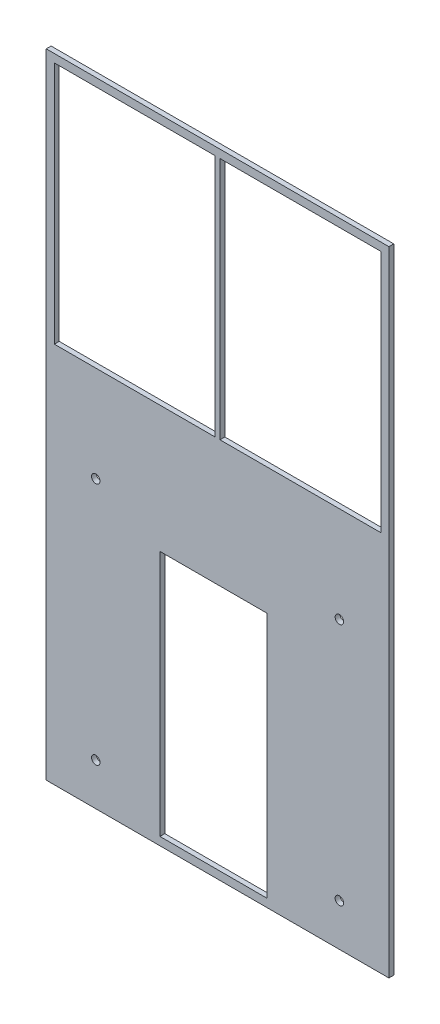
ISO-10303-21;
HEADER;
FILE_DESCRIPTION(('STEP AP214'),'2;1');
FILE_NAME('part.step','',(''),(''),'','','');
FILE_SCHEMA(('AUTOMOTIVE_DESIGN { 1 0 10303 214 1 1 1 1 }'));
ENDSEC;
DATA;
#1=APPLICATION_CONTEXT('core data for automotive mechanical design processes');
#2=APPLICATION_PROTOCOL_DEFINITION('international standard','automotive_design',2000,#1);
#3=PRODUCT_CONTEXT('',#1,'mechanical');
#4=PRODUCT('Part','Part','',(#3));
#5=PRODUCT_RELATED_PRODUCT_CATEGORY('part','',(#4));
#6=PRODUCT_DEFINITION_FORMATION('','',#4);
#7=PRODUCT_DEFINITION_CONTEXT('part definition',#1,'design');
#8=PRODUCT_DEFINITION('design','',#6,#7);
#9=PRODUCT_DEFINITION_SHAPE('','',#8);
#10=(LENGTH_UNIT() NAMED_UNIT(*) SI_UNIT(.MILLI.,.METRE.));
#11=(NAMED_UNIT(*) PLANE_ANGLE_UNIT() SI_UNIT($,.RADIAN.));
#12=(NAMED_UNIT(*) SI_UNIT($,.STERADIAN.) SOLID_ANGLE_UNIT());
#13=UNCERTAINTY_MEASURE_WITH_UNIT(LENGTH_MEASURE(1.E-05),#10,'distance_accuracy_value','');
#14=(GEOMETRIC_REPRESENTATION_CONTEXT(3) GLOBAL_UNCERTAINTY_ASSIGNED_CONTEXT((#13)) GLOBAL_UNIT_ASSIGNED_CONTEXT((#10,
#11,#12)) REPRESENTATION_CONTEXT('',''));
#15=CARTESIAN_POINT('',(0.,0.,0.));
#16=DIRECTION('',(0.,0.,1.));
#17=DIRECTION('',(1.,0.,0.));
#18=AXIS2_PLACEMENT_3D('',#15,#16,#17);
#19=CARTESIAN_POINT('',(0.,0.,3.));
#20=DIRECTION('',(0.,0.,1.));
#21=DIRECTION('',(1.,0.,0.));
#22=AXIS2_PLACEMENT_3D('',#19,#20,#21);
#23=PLANE('',#22);
#24=CARTESIAN_POINT('',(-24.,-284.,3.));
#25=DIRECTION('',(0.,0.,1.));
#26=DIRECTION('',(1.,0.,0.));
#27=AXIS2_PLACEMENT_3D('',#24,#25,#26);
#28=CIRCLE('',#27,2.59999999999999);
#29=CARTESIAN_POINT('',(-21.4,-284.,3.));
#30=VERTEX_POINT('',#29);
#31=EDGE_CURVE('E487',#30,#30,#28,.T.);
#32=ORIENTED_EDGE('',*,*,#31,.F.);
#33=EDGE_LOOP('',(#32));
#34=FACE_BOUND('',#33,.T.);
#35=CARTESIAN_POINT('',(126.,-284.,3.));
#36=DIRECTION('',(0.,0.,1.));
#37=DIRECTION('',(1.,0.,0.));
#38=AXIS2_PLACEMENT_3D('',#35,#36,#37);
#39=CIRCLE('',#38,2.59999999999999);
#40=CARTESIAN_POINT('',(128.6,-284.,3.));
#41=VERTEX_POINT('',#40);
#42=EDGE_CURVE('E489',#41,#41,#39,.T.);
#43=ORIENTED_EDGE('',*,*,#42,.F.);
#44=EDGE_LOOP('',(#43));
#45=FACE_BOUND('',#44,.T.);
#46=CARTESIAN_POINT('',(126.,-134.,3.));
#47=DIRECTION('',(0.,0.,1.));
#48=DIRECTION('',(1.,0.,0.));
#49=AXIS2_PLACEMENT_3D('',#46,#47,#48);
#50=CIRCLE('',#49,2.59999999999996);
#51=CARTESIAN_POINT('',(128.6,-134.,3.));
#52=VERTEX_POINT('',#51);
#53=EDGE_CURVE('E500',#52,#52,#50,.T.);
#54=ORIENTED_EDGE('',*,*,#53,.F.);
#55=EDGE_LOOP('',(#54));
#56=FACE_BOUND('',#55,.T.);
#57=CARTESIAN_POINT('',(-24.,-134.,3.));
#58=DIRECTION('',(0.,0.,1.));
#59=DIRECTION('',(1.,0.,0.));
#60=AXIS2_PLACEMENT_3D('',#57,#58,#59);
#61=CIRCLE('',#60,2.59999999999999);
#62=CARTESIAN_POINT('',(-21.4,-134.,3.));
#63=VERTEX_POINT('',#62);
#64=EDGE_CURVE('E494',#63,#63,#61,.T.);
#65=ORIENTED_EDGE('',*,*,#64,.F.);
#66=EDGE_LOOP('',(#65));
#67=FACE_BOUND('',#66,.T.);
#68=DIRECTION('',(0.,-1.,0.));
#69=VECTOR('',#68,1.);
#70=CARTESIAN_POINT('',(-54.5,80.,3.));
#71=LINE('',#70,#69);
#72=CARTESIAN_POINT('',(-54.5,80.,3.));
#73=VERTEX_POINT('',#72);
#74=CARTESIAN_POINT('',(-54.5,-310.,3.));
#75=VERTEX_POINT('',#74);
#76=EDGE_CURVE('E246',#73,#75,#71,.T.);
#77=ORIENTED_EDGE('',*,*,#76,.T.);
#78=DIRECTION('',(1.,0.,0.));
#79=VECTOR('',#78,1.);
#80=CARTESIAN_POINT('',(-54.5,-310.,3.));
#81=LINE('',#80,#79);
#82=CARTESIAN_POINT('',(156.5,-310.,3.));
#83=VERTEX_POINT('',#82);
#84=EDGE_CURVE('E249',#75,#83,#81,.T.);
#85=ORIENTED_EDGE('',*,*,#84,.T.);
#86=DIRECTION('',(0.,1.,0.));
#87=VECTOR('',#86,1.);
#88=CARTESIAN_POINT('',(156.5,80.,3.));
#89=LINE('',#88,#87);
#90=CARTESIAN_POINT('',(156.5,80.,3.));
#91=VERTEX_POINT('',#90);
#92=EDGE_CURVE('E252',#83,#91,#89,.T.);
#93=ORIENTED_EDGE('',*,*,#92,.T.);
#94=DIRECTION('',(-1.,0.,0.));
#95=VECTOR('',#94,1.);
#96=CARTESIAN_POINT('',(-54.5,80.,3.));
#97=LINE('',#96,#95);
#98=EDGE_CURVE('E254',#91,#73,#97,.T.);
#99=ORIENTED_EDGE('',*,*,#98,.T.);
#100=EDGE_LOOP('',(#77,#85,#93,#99));
#101=FACE_BOUND('',#100,.T.);
#102=DIRECTION('',(1.,0.,0.));
#103=VECTOR('',#102,1.);
#104=CARTESIAN_POINT('',(-49.5,-75.,3.));
#105=LINE('',#104,#103);
#106=CARTESIAN_POINT('',(-49.5,-75.,3.));
#107=VERTEX_POINT('',#106);
#108=CARTESIAN_POINT('',(49.5,-75.,3.));
#109=VERTEX_POINT('',#108);
#110=EDGE_CURVE('E217',#107,#109,#105,.T.);
#111=ORIENTED_EDGE('',*,*,#110,.F.);
#112=DIRECTION('',(0.,-1.,0.));
#113=VECTOR('',#112,1.);
#114=CARTESIAN_POINT('',(-49.5,75.,3.));
#115=LINE('',#114,#113);
#116=CARTESIAN_POINT('',(-49.5,75.,3.));
#117=VERTEX_POINT('',#116);
#118=EDGE_CURVE('E215',#117,#107,#115,.T.);
#119=ORIENTED_EDGE('',*,*,#118,.F.);
#120=DIRECTION('',(-1.,0.,0.));
#121=VECTOR('',#120,1.);
#122=CARTESIAN_POINT('',(-49.5,75.,3.));
#123=LINE('',#122,#121);
#124=CARTESIAN_POINT('',(49.5,75.,3.));
#125=VERTEX_POINT('',#124);
#126=EDGE_CURVE('E223',#125,#117,#123,.T.);
#127=ORIENTED_EDGE('',*,*,#126,.F.);
#128=DIRECTION('',(0.,1.,0.));
#129=VECTOR('',#128,1.);
#130=CARTESIAN_POINT('',(49.5,75.,3.));
#131=LINE('',#130,#129);
#132=EDGE_CURVE('E220',#109,#125,#131,.T.);
#133=ORIENTED_EDGE('',*,*,#132,.F.);
#134=EDGE_LOOP('',(#111,#119,#127,#133));
#135=FACE_BOUND('',#134,.T.);
#136=DIRECTION('',(1.,0.,0.));
#137=VECTOR('',#136,1.);
#138=CARTESIAN_POINT('',(52.5,-75.,3.));
#139=LINE('',#138,#137);
#140=CARTESIAN_POINT('',(52.5,-75.,3.));
#141=VERTEX_POINT('',#140);
#142=CARTESIAN_POINT('',(151.5,-75.,3.));
#143=VERTEX_POINT('',#142);
#144=EDGE_CURVE('E186',#141,#143,#139,.T.);
#145=ORIENTED_EDGE('',*,*,#144,.F.);
#146=DIRECTION('',(0.,-1.,0.));
#147=VECTOR('',#146,1.);
#148=CARTESIAN_POINT('',(52.5,75.,3.));
#149=LINE('',#148,#147);
#150=CARTESIAN_POINT('',(52.5,75.,3.));
#151=VERTEX_POINT('',#150);
#152=EDGE_CURVE('E184',#151,#141,#149,.T.);
#153=ORIENTED_EDGE('',*,*,#152,.F.);
#154=DIRECTION('',(-1.,0.,0.));
#155=VECTOR('',#154,1.);
#156=CARTESIAN_POINT('',(52.5,75.,3.));
#157=LINE('',#156,#155);
#158=CARTESIAN_POINT('',(151.5,75.,3.));
#159=VERTEX_POINT('',#158);
#160=EDGE_CURVE('E192',#159,#151,#157,.T.);
#161=ORIENTED_EDGE('',*,*,#160,.F.);
#162=DIRECTION('',(0.,1.,0.));
#163=VECTOR('',#162,1.);
#164=CARTESIAN_POINT('',(151.5,75.,3.));
#165=LINE('',#164,#163);
#166=EDGE_CURVE('E189',#143,#159,#165,.T.);
#167=ORIENTED_EDGE('',*,*,#166,.F.);
#168=EDGE_LOOP('',(#145,#153,#161,#167));
#169=FACE_BOUND('',#168,.T.);
#170=DIRECTION('',(1.,0.,0.));
#171=VECTOR('',#170,1.);
#172=CARTESIAN_POINT('',(15.5,-305.,3.));
#173=LINE('',#172,#171);
#174=CARTESIAN_POINT('',(15.5,-305.,3.));
#175=VERTEX_POINT('',#174);
#176=CARTESIAN_POINT('',(81.5,-305.,3.));
#177=VERTEX_POINT('',#176);
#178=EDGE_CURVE('E154',#175,#177,#173,.T.);
#179=ORIENTED_EDGE('',*,*,#178,.F.);
#180=DIRECTION('',(0.,-1.,0.));
#181=VECTOR('',#180,1.);
#182=CARTESIAN_POINT('',(15.5,-153.,3.));
#183=LINE('',#182,#181);
#184=CARTESIAN_POINT('',(15.5,-153.,3.));
#185=VERTEX_POINT('',#184);
#186=EDGE_CURVE('E146',#185,#175,#183,.T.);
#187=ORIENTED_EDGE('',*,*,#186,.F.);
#188=DIRECTION('',(-1.,0.,0.));
#189=VECTOR('',#188,1.);
#190=CARTESIAN_POINT('',(15.5,-153.,3.));
#191=LINE('',#190,#189);
#192=CARTESIAN_POINT('',(81.5,-153.,3.));
#193=VERTEX_POINT('',#192);
#194=EDGE_CURVE('E168',#193,#185,#191,.T.);
#195=ORIENTED_EDGE('',*,*,#194,.F.);
#196=DIRECTION('',(0.,1.,0.));
#197=VECTOR('',#196,1.);
#198=CARTESIAN_POINT('',(81.5,-153.,3.));
#199=LINE('',#198,#197);
#200=EDGE_CURVE('E166',#177,#193,#199,.T.);
#201=ORIENTED_EDGE('',*,*,#200,.F.);
#202=EDGE_LOOP('',(#179,#187,#195,#201));
#203=FACE_BOUND('',#202,.T.);
#204=ADVANCED_FACE('F33',(#34,#45,#56,#67,#101,#135,#169,#203),#23,.T.);
#205=CARTESIAN_POINT('',(0.,0.,0.));
#206=DIRECTION('',(0.,0.,1.));
#207=DIRECTION('',(1.,0.,0.));
#208=AXIS2_PLACEMENT_3D('',#205,#206,#207);
#209=PLANE('',#208);
#210=CARTESIAN_POINT('',(-24.,-284.,0.));
#211=DIRECTION('',(0.,0.,1.));
#212=DIRECTION('',(1.,0.,0.));
#213=AXIS2_PLACEMENT_3D('',#210,#211,#212);
#214=CIRCLE('',#213,2.59999999999999);
#215=CARTESIAN_POINT('',(-21.4,-284.,0.));
#216=VERTEX_POINT('',#215);
#217=EDGE_CURVE('E485',#216,#216,#214,.T.);
#218=ORIENTED_EDGE('',*,*,#217,.T.);
#219=EDGE_LOOP('',(#218));
#220=FACE_BOUND('',#219,.T.);
#221=CARTESIAN_POINT('',(126.,-284.,0.));
#222=DIRECTION('',(0.,0.,1.));
#223=DIRECTION('',(1.,0.,0.));
#224=AXIS2_PLACEMENT_3D('',#221,#222,#223);
#225=CIRCLE('',#224,2.59999999999999);
#226=CARTESIAN_POINT('',(128.6,-284.,0.));
#227=VERTEX_POINT('',#226);
#228=EDGE_CURVE('E505',#227,#227,#225,.T.);
#229=ORIENTED_EDGE('',*,*,#228,.T.);
#230=EDGE_LOOP('',(#229));
#231=FACE_BOUND('',#230,.T.);
#232=CARTESIAN_POINT('',(126.,-134.,0.));
#233=DIRECTION('',(0.,0.,1.));
#234=DIRECTION('',(1.,0.,0.));
#235=AXIS2_PLACEMENT_3D('',#232,#233,#234);
#236=CIRCLE('',#235,2.59999999999996);
#237=CARTESIAN_POINT('',(128.6,-134.,0.));
#238=VERTEX_POINT('',#237);
#239=EDGE_CURVE('E496',#238,#238,#236,.T.);
#240=ORIENTED_EDGE('',*,*,#239,.T.);
#241=EDGE_LOOP('',(#240));
#242=FACE_BOUND('',#241,.T.);
#243=CARTESIAN_POINT('',(-24.,-134.,0.));
#244=DIRECTION('',(0.,0.,1.));
#245=DIRECTION('',(1.,0.,0.));
#246=AXIS2_PLACEMENT_3D('',#243,#244,#245);
#247=CIRCLE('',#246,2.59999999999999);
#248=CARTESIAN_POINT('',(-21.4,-134.,0.));
#249=VERTEX_POINT('',#248);
#250=EDGE_CURVE('E174',#249,#249,#247,.T.);
#251=ORIENTED_EDGE('',*,*,#250,.T.);
#252=EDGE_LOOP('',(#251));
#253=FACE_BOUND('',#252,.T.);
#254=DIRECTION('',(0.,-1.,0.));
#255=VECTOR('',#254,1.);
#256=CARTESIAN_POINT('',(52.5,75.,0.));
#257=LINE('',#256,#255);
#258=CARTESIAN_POINT('',(52.5,75.,0.));
#259=VERTEX_POINT('',#258);
#260=CARTESIAN_POINT('',(52.5,-75.,0.));
#261=VERTEX_POINT('',#260);
#262=EDGE_CURVE('E162',#259,#261,#257,.T.);
#263=ORIENTED_EDGE('',*,*,#262,.T.);
#264=DIRECTION('',(1.,0.,0.));
#265=VECTOR('',#264,1.);
#266=CARTESIAN_POINT('',(52.5,-75.,0.));
#267=LINE('',#266,#265);
#268=CARTESIAN_POINT('',(151.5,-75.,0.));
#269=VERTEX_POINT('',#268);
#270=EDGE_CURVE('E197',#261,#269,#267,.T.);
#271=ORIENTED_EDGE('',*,*,#270,.T.);
#272=DIRECTION('',(0.,1.,0.));
#273=VECTOR('',#272,1.);
#274=CARTESIAN_POINT('',(151.5,75.,0.));
#275=LINE('',#274,#273);
#276=CARTESIAN_POINT('',(151.5,75.,0.));
#277=VERTEX_POINT('',#276);
#278=EDGE_CURVE('E200',#269,#277,#275,.T.);
#279=ORIENTED_EDGE('',*,*,#278,.T.);
#280=DIRECTION('',(-1.,0.,0.));
#281=VECTOR('',#280,1.);
#282=CARTESIAN_POINT('',(52.5,75.,0.));
#283=LINE('',#282,#281);
#284=EDGE_CURVE('E187',#277,#259,#283,.T.);
#285=ORIENTED_EDGE('',*,*,#284,.T.);
#286=EDGE_LOOP('',(#263,#271,#279,#285));
#287=FACE_BOUND('',#286,.T.);
#288=DIRECTION('',(0.,-1.,0.));
#289=VECTOR('',#288,1.);
#290=CARTESIAN_POINT('',(-54.5,80.,0.));
#291=LINE('',#290,#289);
#292=CARTESIAN_POINT('',(-54.5,80.,0.));
#293=VERTEX_POINT('',#292);
#294=CARTESIAN_POINT('',(-54.5,-310.,0.));
#295=VERTEX_POINT('',#294);
#296=EDGE_CURVE('E245',#293,#295,#291,.T.);
#297=ORIENTED_EDGE('',*,*,#296,.F.);
#298=DIRECTION('',(-1.,0.,0.));
#299=VECTOR('',#298,1.);
#300=CARTESIAN_POINT('',(-54.5,80.,0.));
#301=LINE('',#300,#299);
#302=CARTESIAN_POINT('',(156.5,80.,0.));
#303=VERTEX_POINT('',#302);
#304=EDGE_CURVE('E250',#303,#293,#301,.T.);
#305=ORIENTED_EDGE('',*,*,#304,.F.);
#306=DIRECTION('',(0.,1.,0.));
#307=VECTOR('',#306,1.);
#308=CARTESIAN_POINT('',(156.5,80.,0.));
#309=LINE('',#308,#307);
#310=CARTESIAN_POINT('',(156.5,-310.,0.));
#311=VERTEX_POINT('',#310);
#312=EDGE_CURVE('E261',#311,#303,#309,.T.);
#313=ORIENTED_EDGE('',*,*,#312,.F.);
#314=DIRECTION('',(1.,0.,0.));
#315=VECTOR('',#314,1.);
#316=CARTESIAN_POINT('',(-54.5,-310.,0.));
#317=LINE('',#316,#315);
#318=EDGE_CURVE('E259',#295,#311,#317,.T.);
#319=ORIENTED_EDGE('',*,*,#318,.F.);
#320=EDGE_LOOP('',(#297,#305,#313,#319));
#321=FACE_BOUND('',#320,.T.);
#322=DIRECTION('',(0.,-1.,0.));
#323=VECTOR('',#322,1.);
#324=CARTESIAN_POINT('',(-49.5,75.,0.));
#325=LINE('',#324,#323);
#326=CARTESIAN_POINT('',(-49.5,75.,0.));
#327=VERTEX_POINT('',#326);
#328=CARTESIAN_POINT('',(-49.5,-75.,0.));
#329=VERTEX_POINT('',#328);
#330=EDGE_CURVE('E214',#327,#329,#325,.T.);
#331=ORIENTED_EDGE('',*,*,#330,.T.);
#332=DIRECTION('',(1.,0.,0.));
#333=VECTOR('',#332,1.);
#334=CARTESIAN_POINT('',(-49.5,-75.,0.));
#335=LINE('',#334,#333);
#336=CARTESIAN_POINT('',(49.5,-75.,0.));
#337=VERTEX_POINT('',#336);
#338=EDGE_CURVE('E228',#329,#337,#335,.T.);
#339=ORIENTED_EDGE('',*,*,#338,.T.);
#340=DIRECTION('',(0.,1.,0.));
#341=VECTOR('',#340,1.);
#342=CARTESIAN_POINT('',(49.5,75.,0.));
#343=LINE('',#342,#341);
#344=CARTESIAN_POINT('',(49.5,75.,0.));
#345=VERTEX_POINT('',#344);
#346=EDGE_CURVE('E231',#337,#345,#343,.T.);
#347=ORIENTED_EDGE('',*,*,#346,.T.);
#348=DIRECTION('',(-1.,0.,0.));
#349=VECTOR('',#348,1.);
#350=CARTESIAN_POINT('',(-49.5,75.,0.));
#351=LINE('',#350,#349);
#352=EDGE_CURVE('E218',#345,#327,#351,.T.);
#353=ORIENTED_EDGE('',*,*,#352,.T.);
#354=EDGE_LOOP('',(#331,#339,#347,#353));
#355=FACE_BOUND('',#354,.T.);
#356=DIRECTION('',(0.,-1.,0.));
#357=VECTOR('',#356,1.);
#358=CARTESIAN_POINT('',(15.5,-153.,0.));
#359=LINE('',#358,#357);
#360=CARTESIAN_POINT('',(15.5,-153.,0.));
#361=VERTEX_POINT('',#360);
#362=CARTESIAN_POINT('',(15.5,-305.,0.));
#363=VERTEX_POINT('',#362);
#364=EDGE_CURVE('E56',#361,#363,#359,.T.);
#365=ORIENTED_EDGE('',*,*,#364,.T.);
#366=DIRECTION('',(1.,0.,0.));
#367=VECTOR('',#366,1.);
#368=CARTESIAN_POINT('',(15.5,-305.,0.));
#369=LINE('',#368,#367);
#370=CARTESIAN_POINT('',(81.5,-305.,0.));
#371=VERTEX_POINT('',#370);
#372=EDGE_CURVE('E161',#363,#371,#369,.T.);
#373=ORIENTED_EDGE('',*,*,#372,.T.);
#374=DIRECTION('',(0.,1.,0.));
#375=VECTOR('',#374,1.);
#376=CARTESIAN_POINT('',(81.5,-153.,0.));
#377=LINE('',#376,#375);
#378=CARTESIAN_POINT('',(81.5,-153.,0.));
#379=VERTEX_POINT('',#378);
#380=EDGE_CURVE('E176',#371,#379,#377,.T.);
#381=ORIENTED_EDGE('',*,*,#380,.T.);
#382=DIRECTION('',(-1.,0.,0.));
#383=VECTOR('',#382,1.);
#384=CARTESIAN_POINT('',(15.5,-153.,0.));
#385=LINE('',#384,#383);
#386=EDGE_CURVE('E155',#379,#361,#385,.T.);
#387=ORIENTED_EDGE('',*,*,#386,.T.);
#388=EDGE_LOOP('',(#365,#373,#381,#387));
#389=FACE_BOUND('',#388,.T.);
#390=ADVANCED_FACE('F279',(#220,#231,#242,#253,#287,#321,#355,#389),#209,.F.);
#391=CARTESIAN_POINT('',(-54.5,80.,3.));
#392=DIRECTION('',(1.,0.,0.));
#393=DIRECTION('',(0.,1.,0.));
#394=AXIS2_PLACEMENT_3D('',#391,#392,#393);
#395=PLANE('',#394);
#396=ORIENTED_EDGE('',*,*,#296,.T.);
#397=DIRECTION('',(0.,0.,-1.));
#398=VECTOR('',#397,1.);
#399=CARTESIAN_POINT('',(-54.5,-310.,3.));
#400=LINE('',#399,#398);
#401=EDGE_CURVE('E11',#75,#295,#400,.T.);
#402=ORIENTED_EDGE('',*,*,#401,.F.);
#403=ORIENTED_EDGE('',*,*,#76,.F.);
#404=DIRECTION('',(0.,0.,-1.));
#405=VECTOR('',#404,1.);
#406=CARTESIAN_POINT('',(-54.5,80.,3.));
#407=LINE('',#406,#405);
#408=EDGE_CURVE('E256',#73,#293,#407,.T.);
#409=ORIENTED_EDGE('',*,*,#408,.T.);
#410=EDGE_LOOP('',(#396,#402,#403,#409));
#411=FACE_BOUND('',#410,.T.);
#412=ADVANCED_FACE('F35',(#411),#395,.F.);
#413=CARTESIAN_POINT('',(-54.5,-310.,3.));
#414=DIRECTION('',(0.,1.,0.));
#415=DIRECTION('',(0.,0.,1.));
#416=AXIS2_PLACEMENT_3D('',#413,#414,#415);
#417=PLANE('',#416);
#418=ORIENTED_EDGE('',*,*,#318,.T.);
#419=DIRECTION('',(0.,0.,-1.));
#420=VECTOR('',#419,1.);
#421=CARTESIAN_POINT('',(156.5,-310.,3.));
#422=LINE('',#421,#420);
#423=EDGE_CURVE('E41',#83,#311,#422,.T.);
#424=ORIENTED_EDGE('',*,*,#423,.F.);
#425=ORIENTED_EDGE('',*,*,#84,.F.);
#426=ORIENTED_EDGE('',*,*,#401,.T.);
#427=EDGE_LOOP('',(#418,#424,#425,#426));
#428=FACE_BOUND('',#427,.T.);
#429=ADVANCED_FACE('F290',(#428),#417,.F.);
#430=CARTESIAN_POINT('',(156.5,80.,3.));
#431=DIRECTION('',(-1.,0.,0.));
#432=DIRECTION('',(0.,-1.,0.));
#433=AXIS2_PLACEMENT_3D('',#430,#431,#432);
#434=PLANE('',#433);
#435=ORIENTED_EDGE('',*,*,#312,.T.);
#436=DIRECTION('',(0.,0.,-1.));
#437=VECTOR('',#436,1.);
#438=CARTESIAN_POINT('',(156.5,80.,3.));
#439=LINE('',#438,#437);
#440=EDGE_CURVE('E266',#91,#303,#439,.T.);
#441=ORIENTED_EDGE('',*,*,#440,.F.);
#442=ORIENTED_EDGE('',*,*,#92,.F.);
#443=ORIENTED_EDGE('',*,*,#423,.T.);
#444=EDGE_LOOP('',(#435,#441,#442,#443));
#445=FACE_BOUND('',#444,.T.);
#446=ADVANCED_FACE('F273',(#445),#434,.F.);
#447=CARTESIAN_POINT('',(-54.5,80.,3.));
#448=DIRECTION('',(0.,-1.,0.));
#449=DIRECTION('',(0.,0.,-1.));
#450=AXIS2_PLACEMENT_3D('',#447,#448,#449);
#451=PLANE('',#450);
#452=ORIENTED_EDGE('',*,*,#304,.T.);
#453=ORIENTED_EDGE('',*,*,#408,.F.);
#454=ORIENTED_EDGE('',*,*,#98,.F.);
#455=ORIENTED_EDGE('',*,*,#440,.T.);
#456=EDGE_LOOP('',(#452,#453,#454,#455));
#457=FACE_BOUND('',#456,.T.);
#458=ADVANCED_FACE('F283',(#457),#451,.F.);
#459=CARTESIAN_POINT('',(-49.5,75.,3.));
#460=DIRECTION('',(1.,0.,0.));
#461=DIRECTION('',(0.,0.,-1.));
#462=AXIS2_PLACEMENT_3D('',#459,#460,#461);
#463=PLANE('',#462);
#464=ORIENTED_EDGE('',*,*,#330,.F.);
#465=DIRECTION('',(0.,0.,-1.));
#466=VECTOR('',#465,1.);
#467=CARTESIAN_POINT('',(-49.5,75.,3.));
#468=LINE('',#467,#466);
#469=EDGE_CURVE('E225',#117,#327,#468,.T.);
#470=ORIENTED_EDGE('',*,*,#469,.F.);
#471=ORIENTED_EDGE('',*,*,#118,.T.);
#472=DIRECTION('',(0.,0.,-1.));
#473=VECTOR('',#472,1.);
#474=CARTESIAN_POINT('',(-49.5,-75.,3.));
#475=LINE('',#474,#473);
#476=EDGE_CURVE('E242',#107,#329,#475,.T.);
#477=ORIENTED_EDGE('',*,*,#476,.T.);
#478=EDGE_LOOP('',(#464,#470,#471,#477));
#479=FACE_BOUND('',#478,.T.);
#480=ADVANCED_FACE('F308',(#479),#463,.T.);
#481=CARTESIAN_POINT('',(-49.5,-75.,3.));
#482=DIRECTION('',(0.,1.,0.));
#483=DIRECTION('',(0.,0.,1.));
#484=AXIS2_PLACEMENT_3D('',#481,#482,#483);
#485=PLANE('',#484);
#486=ORIENTED_EDGE('',*,*,#338,.F.);
#487=ORIENTED_EDGE('',*,*,#476,.F.);
#488=ORIENTED_EDGE('',*,*,#110,.T.);
#489=DIRECTION('',(0.,0.,-1.));
#490=VECTOR('',#489,1.);
#491=CARTESIAN_POINT('',(49.5,-75.,3.));
#492=LINE('',#491,#490);
#493=EDGE_CURVE('E240',#109,#337,#492,.T.);
#494=ORIENTED_EDGE('',*,*,#493,.T.);
#495=EDGE_LOOP('',(#486,#487,#488,#494));
#496=FACE_BOUND('',#495,.T.);
#497=ADVANCED_FACE('F315',(#496),#485,.T.);
#498=CARTESIAN_POINT('',(49.5,75.,3.));
#499=DIRECTION('',(-1.,0.,0.));
#500=DIRECTION('',(0.,0.,1.));
#501=AXIS2_PLACEMENT_3D('',#498,#499,#500);
#502=PLANE('',#501);
#503=ORIENTED_EDGE('',*,*,#346,.F.);
#504=ORIENTED_EDGE('',*,*,#493,.F.);
#505=ORIENTED_EDGE('',*,*,#132,.T.);
#506=DIRECTION('',(0.,0.,-1.));
#507=VECTOR('',#506,1.);
#508=CARTESIAN_POINT('',(49.5,75.,3.));
#509=LINE('',#508,#507);
#510=EDGE_CURVE('E238',#125,#345,#509,.T.);
#511=ORIENTED_EDGE('',*,*,#510,.T.);
#512=EDGE_LOOP('',(#503,#504,#505,#511));
#513=FACE_BOUND('',#512,.T.);
#514=ADVANCED_FACE('F320',(#513),#502,.T.);
#515=CARTESIAN_POINT('',(-49.5,75.,3.));
#516=DIRECTION('',(0.,-1.,0.));
#517=DIRECTION('',(0.,0.,-1.));
#518=AXIS2_PLACEMENT_3D('',#515,#516,#517);
#519=PLANE('',#518);
#520=ORIENTED_EDGE('',*,*,#352,.F.);
#521=ORIENTED_EDGE('',*,*,#510,.F.);
#522=ORIENTED_EDGE('',*,*,#126,.T.);
#523=ORIENTED_EDGE('',*,*,#469,.T.);
#524=EDGE_LOOP('',(#520,#521,#522,#523));
#525=FACE_BOUND('',#524,.T.);
#526=ADVANCED_FACE('F327',(#525),#519,.T.);
#527=CARTESIAN_POINT('',(52.5,75.,3.));
#528=DIRECTION('',(1.,0.,0.));
#529=DIRECTION('',(0.,1.,0.));
#530=AXIS2_PLACEMENT_3D('',#527,#528,#529);
#531=PLANE('',#530);
#532=ORIENTED_EDGE('',*,*,#262,.F.);
#533=DIRECTION('',(0.,0.,-1.));
#534=VECTOR('',#533,1.);
#535=CARTESIAN_POINT('',(52.5,75.,3.));
#536=LINE('',#535,#534);
#537=EDGE_CURVE('E194',#151,#259,#536,.T.);
#538=ORIENTED_EDGE('',*,*,#537,.F.);
#539=ORIENTED_EDGE('',*,*,#152,.T.);
#540=DIRECTION('',(0.,0.,-1.));
#541=VECTOR('',#540,1.);
#542=CARTESIAN_POINT('',(52.5,-75.,3.));
#543=LINE('',#542,#541);
#544=EDGE_CURVE('E211',#141,#261,#543,.T.);
#545=ORIENTED_EDGE('',*,*,#544,.T.);
#546=EDGE_LOOP('',(#532,#538,#539,#545));
#547=FACE_BOUND('',#546,.T.);
#548=ADVANCED_FACE('F350',(#547),#531,.T.);
#549=CARTESIAN_POINT('',(52.5,-75.,3.));
#550=DIRECTION('',(0.,1.,0.));
#551=DIRECTION('',(-1.,0.,0.));
#552=AXIS2_PLACEMENT_3D('',#549,#550,#551);
#553=PLANE('',#552);
#554=ORIENTED_EDGE('',*,*,#270,.F.);
#555=ORIENTED_EDGE('',*,*,#544,.F.);
#556=ORIENTED_EDGE('',*,*,#144,.T.);
#557=DIRECTION('',(0.,0.,-1.));
#558=VECTOR('',#557,1.);
#559=CARTESIAN_POINT('',(151.5,-75.,3.));
#560=LINE('',#559,#558);
#561=EDGE_CURVE('E209',#143,#269,#560,.T.);
#562=ORIENTED_EDGE('',*,*,#561,.T.);
#563=EDGE_LOOP('',(#554,#555,#556,#562));
#564=FACE_BOUND('',#563,.T.);
#565=ADVANCED_FACE('F343',(#564),#553,.T.);
#566=CARTESIAN_POINT('',(151.5,75.,3.));
#567=DIRECTION('',(-1.,0.,0.));
#568=DIRECTION('',(0.,-1.,0.));
#569=AXIS2_PLACEMENT_3D('',#566,#567,#568);
#570=PLANE('',#569);
#571=ORIENTED_EDGE('',*,*,#278,.F.);
#572=ORIENTED_EDGE('',*,*,#561,.F.);
#573=ORIENTED_EDGE('',*,*,#166,.T.);
#574=DIRECTION('',(0.,0.,-1.));
#575=VECTOR('',#574,1.);
#576=CARTESIAN_POINT('',(151.5,75.,3.));
#577=LINE('',#576,#575);
#578=EDGE_CURVE('E207',#159,#277,#577,.T.);
#579=ORIENTED_EDGE('',*,*,#578,.T.);
#580=EDGE_LOOP('',(#571,#572,#573,#579));
#581=FACE_BOUND('',#580,.T.);
#582=ADVANCED_FACE('F346',(#581),#570,.T.);
#583=CARTESIAN_POINT('',(52.5,75.,3.));
#584=DIRECTION('',(0.,-1.,0.));
#585=DIRECTION('',(0.,0.,-1.));
#586=AXIS2_PLACEMENT_3D('',#583,#584,#585);
#587=PLANE('',#586);
#588=ORIENTED_EDGE('',*,*,#284,.F.);
#589=ORIENTED_EDGE('',*,*,#578,.F.);
#590=ORIENTED_EDGE('',*,*,#160,.T.);
#591=ORIENTED_EDGE('',*,*,#537,.T.);
#592=EDGE_LOOP('',(#588,#589,#590,#591));
#593=FACE_BOUND('',#592,.T.);
#594=ADVANCED_FACE('F353',(#593),#587,.T.);
#595=CARTESIAN_POINT('',(15.5,-153.,3.));
#596=DIRECTION('',(1.,0.,0.));
#597=DIRECTION('',(0.,1.,0.));
#598=AXIS2_PLACEMENT_3D('',#595,#596,#597);
#599=PLANE('',#598);
#600=ORIENTED_EDGE('',*,*,#364,.F.);
#601=DIRECTION('',(0.,0.,-1.));
#602=VECTOR('',#601,1.);
#603=CARTESIAN_POINT('',(15.5,-153.,3.));
#604=LINE('',#603,#602);
#605=EDGE_CURVE('E150',#185,#361,#604,.T.);
#606=ORIENTED_EDGE('',*,*,#605,.F.);
#607=ORIENTED_EDGE('',*,*,#186,.T.);
#608=DIRECTION('',(0.,0.,-1.));
#609=VECTOR('',#608,1.);
#610=CARTESIAN_POINT('',(15.5,-305.,3.));
#611=LINE('',#610,#609);
#612=EDGE_CURVE('E149',#175,#363,#611,.T.);
#613=ORIENTED_EDGE('',*,*,#612,.T.);
#614=EDGE_LOOP('',(#600,#606,#607,#613));
#615=FACE_BOUND('',#614,.T.);
#616=ADVANCED_FACE('F148',(#615),#599,.T.);
#617=CARTESIAN_POINT('',(15.5,-305.,3.));
#618=DIRECTION('',(0.,1.,0.));
#619=DIRECTION('',(0.,0.,1.));
#620=AXIS2_PLACEMENT_3D('',#617,#618,#619);
#621=PLANE('',#620);
#622=ORIENTED_EDGE('',*,*,#372,.F.);
#623=ORIENTED_EDGE('',*,*,#612,.F.);
#624=ORIENTED_EDGE('',*,*,#178,.T.);
#625=DIRECTION('',(0.,0.,-1.));
#626=VECTOR('',#625,1.);
#627=CARTESIAN_POINT('',(81.5,-305.,3.));
#628=LINE('',#627,#626);
#629=EDGE_CURVE('E163',#177,#371,#628,.T.);
#630=ORIENTED_EDGE('',*,*,#629,.T.);
#631=EDGE_LOOP('',(#622,#623,#624,#630));
#632=FACE_BOUND('',#631,.T.);
#633=ADVANCED_FACE('F158',(#632),#621,.T.);
#634=CARTESIAN_POINT('',(81.5,-153.,3.));
#635=DIRECTION('',(-1.,0.,0.));
#636=DIRECTION('',(0.,0.,1.));
#637=AXIS2_PLACEMENT_3D('',#634,#635,#636);
#638=PLANE('',#637);
#639=ORIENTED_EDGE('',*,*,#380,.F.);
#640=ORIENTED_EDGE('',*,*,#629,.F.);
#641=ORIENTED_EDGE('',*,*,#200,.T.);
#642=DIRECTION('',(0.,0.,-1.));
#643=VECTOR('',#642,1.);
#644=CARTESIAN_POINT('',(81.5,-153.,3.));
#645=LINE('',#644,#643);
#646=EDGE_CURVE('E48',#193,#379,#645,.T.);
#647=ORIENTED_EDGE('',*,*,#646,.T.);
#648=EDGE_LOOP('',(#639,#640,#641,#647));
#649=FACE_BOUND('',#648,.T.);
#650=ADVANCED_FACE('F410',(#649),#638,.T.);
#651=CARTESIAN_POINT('',(15.5,-153.,3.));
#652=DIRECTION('',(0.,-1.,0.));
#653=DIRECTION('',(0.,0.,-1.));
#654=AXIS2_PLACEMENT_3D('',#651,#652,#653);
#655=PLANE('',#654);
#656=ORIENTED_EDGE('',*,*,#386,.F.);
#657=ORIENTED_EDGE('',*,*,#646,.F.);
#658=ORIENTED_EDGE('',*,*,#194,.T.);
#659=ORIENTED_EDGE('',*,*,#605,.T.);
#660=EDGE_LOOP('',(#656,#657,#658,#659));
#661=FACE_BOUND('',#660,.T.);
#662=ADVANCED_FACE('F418',(#661),#655,.T.);
#663=CARTESIAN_POINT('',(-24.,-134.,0.));
#664=DIRECTION('',(0.,0.,1.));
#665=DIRECTION('',(1.,0.,0.));
#666=AXIS2_PLACEMENT_3D('',#663,#664,#665);
#667=CYLINDRICAL_SURFACE('',#666,2.59999999999999);
#668=ORIENTED_EDGE('',*,*,#250,.F.);
#669=EDGE_LOOP('',(#668));
#670=FACE_BOUND('',#669,.T.);
#671=ORIENTED_EDGE('',*,*,#64,.T.);
#672=EDGE_LOOP('',(#671));
#673=FACE_BOUND('',#672,.T.);
#674=ADVANCED_FACE('F427',(#670,#673),#667,.F.);
#675=CARTESIAN_POINT('',(126.,-134.,0.));
#676=DIRECTION('',(0.,0.,1.));
#677=DIRECTION('',(1.,0.,0.));
#678=AXIS2_PLACEMENT_3D('',#675,#676,#677);
#679=CYLINDRICAL_SURFACE('',#678,2.59999999999996);
#680=ORIENTED_EDGE('',*,*,#239,.F.);
#681=EDGE_LOOP('',(#680));
#682=FACE_BOUND('',#681,.T.);
#683=ORIENTED_EDGE('',*,*,#53,.T.);
#684=EDGE_LOOP('',(#683));
#685=FACE_BOUND('',#684,.T.);
#686=ADVANCED_FACE('F448',(#682,#685),#679,.F.);
#687=CARTESIAN_POINT('',(126.,-284.,0.));
#688=DIRECTION('',(0.,0.,1.));
#689=DIRECTION('',(1.,0.,0.));
#690=AXIS2_PLACEMENT_3D('',#687,#688,#689);
#691=CYLINDRICAL_SURFACE('',#690,2.59999999999999);
#692=ORIENTED_EDGE('',*,*,#228,.F.);
#693=EDGE_LOOP('',(#692));
#694=FACE_BOUND('',#693,.T.);
#695=ORIENTED_EDGE('',*,*,#42,.T.);
#696=EDGE_LOOP('',(#695));
#697=FACE_BOUND('',#696,.T.);
#698=ADVANCED_FACE('F458',(#694,#697),#691,.F.);
#699=CARTESIAN_POINT('',(-24.,-284.,0.));
#700=DIRECTION('',(0.,0.,1.));
#701=DIRECTION('',(1.,0.,0.));
#702=AXIS2_PLACEMENT_3D('',#699,#700,#701);
#703=CYLINDRICAL_SURFACE('',#702,2.59999999999999);
#704=ORIENTED_EDGE('',*,*,#217,.F.);
#705=EDGE_LOOP('',(#704));
#706=FACE_BOUND('',#705,.T.);
#707=ORIENTED_EDGE('',*,*,#31,.T.);
#708=EDGE_LOOP('',(#707));
#709=FACE_BOUND('',#708,.T.);
#710=ADVANCED_FACE('F468',(#706,#709),#703,.F.);
#711=CLOSED_SHELL('',(#204,#390,#412,#429,#446,#458,#480,#497,#514,#526,#548,#565,#582,#594,
#616,#633,#650,#662,#674,#686,#698,#710));
#712=MANIFOLD_SOLID_BREP('B2',#711);
#713=ADVANCED_BREP_SHAPE_REPRESENTATION('',(#18,#712),#14);
#714=SHAPE_DEFINITION_REPRESENTATION(#9,#713);
ENDSEC;
END-ISO-10303-21;
